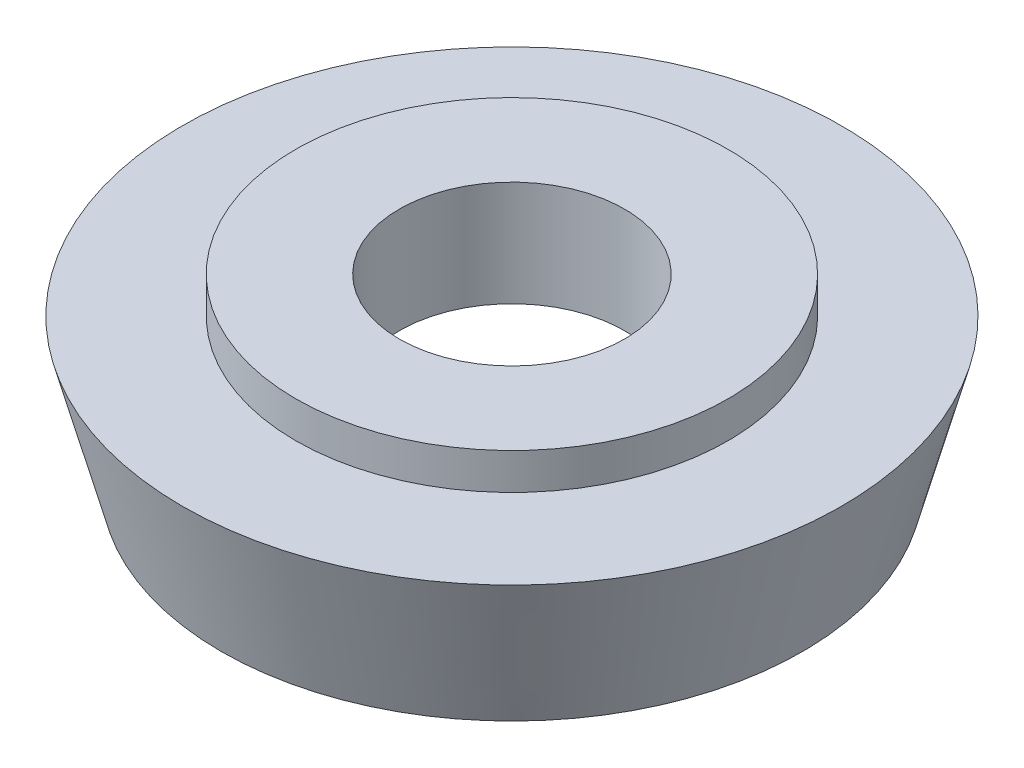
ISO-10303-21;
HEADER;
FILE_DESCRIPTION(('STEP AP214'),'2;1');
FILE_NAME('part.step','',(''),(''),'','','');
FILE_SCHEMA(('AUTOMOTIVE_DESIGN { 1 0 10303 214 1 1 1 1 }'));
ENDSEC;
DATA;
#1=APPLICATION_CONTEXT('core data for automotive mechanical design processes');
#2=APPLICATION_PROTOCOL_DEFINITION('international standard','automotive_design',2000,#1);
#3=PRODUCT_CONTEXT('',#1,'mechanical');
#4=PRODUCT('Part','Part','',(#3));
#5=PRODUCT_RELATED_PRODUCT_CATEGORY('part','',(#4));
#6=PRODUCT_DEFINITION_FORMATION('','',#4);
#7=PRODUCT_DEFINITION_CONTEXT('part definition',#1,'design');
#8=PRODUCT_DEFINITION('design','',#6,#7);
#9=PRODUCT_DEFINITION_SHAPE('','',#8);
#10=(LENGTH_UNIT() NAMED_UNIT(*) SI_UNIT(.MILLI.,.METRE.));
#11=(NAMED_UNIT(*) PLANE_ANGLE_UNIT() SI_UNIT($,.RADIAN.));
#12=(NAMED_UNIT(*) SI_UNIT($,.STERADIAN.) SOLID_ANGLE_UNIT());
#13=UNCERTAINTY_MEASURE_WITH_UNIT(LENGTH_MEASURE(1.E-05),#10,'distance_accuracy_value','');
#14=(GEOMETRIC_REPRESENTATION_CONTEXT(3) GLOBAL_UNCERTAINTY_ASSIGNED_CONTEXT((#13)) GLOBAL_UNIT_ASSIGNED_CONTEXT((#10,
#11,#12)) REPRESENTATION_CONTEXT('',''));
#15=CARTESIAN_POINT('',(0.,0.,0.));
#16=DIRECTION('',(0.,0.,1.));
#17=DIRECTION('',(1.,0.,0.));
#18=AXIS2_PLACEMENT_3D('',#15,#16,#17);
#19=CARTESIAN_POINT('',(0.,2.5,0.));
#20=DIRECTION('',(0.,1.,0.));
#21=DIRECTION('',(0.,0.,1.));
#22=AXIS2_PLACEMENT_3D('',#19,#20,#21);
#23=CYLINDRICAL_SURFACE('',#22,2.975);
#24=CARTESIAN_POINT('',(0.,2.,0.));
#25=DIRECTION('',(0.,1.,0.));
#26=DIRECTION('',(0.,0.,1.));
#27=AXIS2_PLACEMENT_3D('',#24,#25,#26);
#28=CIRCLE('',#27,2.975);
#29=CARTESIAN_POINT('',(0.,2.,2.975));
#30=VERTEX_POINT('',#29);
#31=EDGE_CURVE('E69',#30,#30,#28,.T.);
#32=ORIENTED_EDGE('',*,*,#31,.T.);
#33=EDGE_LOOP('',(#32));
#34=FACE_BOUND('',#33,.T.);
#35=CARTESIAN_POINT('',(0.,2.5,0.));
#36=DIRECTION('',(0.,1.,0.));
#37=DIRECTION('',(0.,0.,1.));
#38=AXIS2_PLACEMENT_3D('',#35,#36,#37);
#39=CIRCLE('',#38,2.975);
#40=CARTESIAN_POINT('',(0.,2.5,2.975));
#41=VERTEX_POINT('',#40);
#42=EDGE_CURVE('E10',#41,#41,#39,.T.);
#43=ORIENTED_EDGE('',*,*,#42,.F.);
#44=EDGE_LOOP('',(#43));
#45=FACE_BOUND('',#44,.T.);
#46=ADVANCED_FACE('F34',(#34,#45),#23,.T.);
#47=CARTESIAN_POINT('',(-1.55,2.5,0.));
#48=DIRECTION('',(0.,1.,0.));
#49=DIRECTION('',(0.,0.,1.));
#50=AXIS2_PLACEMENT_3D('',#47,#48,#49);
#51=PLANE('',#50);
#52=ORIENTED_EDGE('',*,*,#42,.T.);
#53=EDGE_LOOP('',(#52));
#54=FACE_BOUND('',#53,.T.);
#55=CARTESIAN_POINT('',(0.,2.5,0.));
#56=DIRECTION('',(0.,1.,0.));
#57=DIRECTION('',(0.,0.,1.));
#58=AXIS2_PLACEMENT_3D('',#55,#56,#57);
#59=CIRCLE('',#58,1.55);
#60=CARTESIAN_POINT('',(0.,2.5,1.55));
#61=VERTEX_POINT('',#60);
#62=EDGE_CURVE('E41',#61,#61,#59,.T.);
#63=ORIENTED_EDGE('',*,*,#62,.F.);
#64=EDGE_LOOP('',(#63));
#65=FACE_BOUND('',#64,.T.);
#66=ADVANCED_FACE('F88',(#54,#65),#51,.T.);
#67=CARTESIAN_POINT('',(0.,2.5,0.));
#68=DIRECTION('',(0.,1.,0.));
#69=DIRECTION('',(0.,0.,1.));
#70=AXIS2_PLACEMENT_3D('',#67,#68,#69);
#71=CYLINDRICAL_SURFACE('',#70,1.55);
#72=ORIENTED_EDGE('',*,*,#62,.T.);
#73=EDGE_LOOP('',(#72));
#74=FACE_BOUND('',#73,.T.);
#75=CARTESIAN_POINT('',(0.,1.05,0.));
#76=DIRECTION('',(0.,1.,0.));
#77=DIRECTION('',(0.,0.,1.));
#78=AXIS2_PLACEMENT_3D('',#75,#76,#77);
#79=CIRCLE('',#78,1.55);
#80=CARTESIAN_POINT('',(0.,1.05,1.55));
#81=VERTEX_POINT('',#80);
#82=EDGE_CURVE('E47',#81,#81,#79,.T.);
#83=ORIENTED_EDGE('',*,*,#82,.F.);
#84=EDGE_LOOP('',(#83));
#85=FACE_BOUND('',#84,.T.);
#86=ADVANCED_FACE('F92',(#74,#85),#71,.F.);
#87=CARTESIAN_POINT('',(-3.05,1.05,0.));
#88=DIRECTION('',(0.,-1.,0.));
#89=DIRECTION('',(0.,0.,-1.));
#90=AXIS2_PLACEMENT_3D('',#87,#88,#89);
#91=PLANE('',#90);
#92=ORIENTED_EDGE('',*,*,#82,.T.);
#93=EDGE_LOOP('',(#92));
#94=FACE_BOUND('',#93,.T.);
#95=CARTESIAN_POINT('',(0.,1.05,0.));
#96=DIRECTION('',(0.,1.,0.));
#97=DIRECTION('',(0.,0.,1.));
#98=AXIS2_PLACEMENT_3D('',#95,#96,#97);
#99=CIRCLE('',#98,3.05);
#100=CARTESIAN_POINT('',(0.,1.05,3.05));
#101=VERTEX_POINT('',#100);
#102=EDGE_CURVE('E53',#101,#101,#99,.T.);
#103=ORIENTED_EDGE('',*,*,#102,.F.);
#104=EDGE_LOOP('',(#103));
#105=FACE_BOUND('',#104,.T.);
#106=ADVANCED_FACE('F96',(#94,#105),#91,.T.);
#107=CARTESIAN_POINT('',(0.,2.5,0.));
#108=DIRECTION('',(0.,1.,0.));
#109=DIRECTION('',(0.,0.,1.));
#110=AXIS2_PLACEMENT_3D('',#107,#108,#109);
#111=CYLINDRICAL_SURFACE('',#110,3.05);
#112=ORIENTED_EDGE('',*,*,#102,.T.);
#113=EDGE_LOOP('',(#112));
#114=FACE_BOUND('',#113,.T.);
#115=CARTESIAN_POINT('',(0.,0.,0.));
#116=DIRECTION('',(0.,1.,0.));
#117=DIRECTION('',(0.,0.,1.));
#118=AXIS2_PLACEMENT_3D('',#115,#116,#117);
#119=CIRCLE('',#118,3.05);
#120=CARTESIAN_POINT('',(0.,0.,3.05));
#121=VERTEX_POINT('',#120);
#122=EDGE_CURVE('E59',#121,#121,#119,.T.);
#123=ORIENTED_EDGE('',*,*,#122,.F.);
#124=EDGE_LOOP('',(#123));
#125=FACE_BOUND('',#124,.T.);
#126=ADVANCED_FACE('F102',(#114,#125),#111,.F.);
#127=CARTESIAN_POINT('',(-4.,0.,0.));
#128=DIRECTION('',(0.,-1.,0.));
#129=DIRECTION('',(0.,0.,-1.));
#130=AXIS2_PLACEMENT_3D('',#127,#128,#129);
#131=PLANE('',#130);
#132=ORIENTED_EDGE('',*,*,#122,.T.);
#133=EDGE_LOOP('',(#132));
#134=FACE_BOUND('',#133,.T.);
#135=CARTESIAN_POINT('',(0.,0.,0.));
#136=DIRECTION('',(0.,1.,0.));
#137=DIRECTION('',(0.,0.,1.));
#138=AXIS2_PLACEMENT_3D('',#135,#136,#137);
#139=CIRCLE('',#138,4.);
#140=CARTESIAN_POINT('',(0.,0.,4.));
#141=VERTEX_POINT('',#140);
#142=EDGE_CURVE('E63',#141,#141,#139,.T.);
#143=ORIENTED_EDGE('',*,*,#142,.F.);
#144=EDGE_LOOP('',(#143));
#145=FACE_BOUND('',#144,.T.);
#146=ADVANCED_FACE('F84',(#134,#145),#131,.T.);
#147=CARTESIAN_POINT('',(0.,2.,0.));
#148=DIRECTION('',(0.,1.,0.));
#149=DIRECTION('',(0.,0.,1.));
#150=AXIS2_PLACEMENT_3D('',#147,#148,#149);
#151=CONICAL_SURFACE('',#150,4.53589838486225,0.26179938779915);
#152=ORIENTED_EDGE('',*,*,#142,.T.);
#153=EDGE_LOOP('',(#152));
#154=FACE_BOUND('',#153,.T.);
#155=CARTESIAN_POINT('',(0.,2.,0.));
#156=DIRECTION('',(0.,1.,0.));
#157=DIRECTION('',(0.,0.,1.));
#158=AXIS2_PLACEMENT_3D('',#155,#156,#157);
#159=CIRCLE('',#158,4.53589838486225);
#160=CARTESIAN_POINT('',(0.,2.,4.53589838486225));
#161=VERTEX_POINT('',#160);
#162=EDGE_CURVE('E66',#161,#161,#159,.T.);
#163=ORIENTED_EDGE('',*,*,#162,.F.);
#164=EDGE_LOOP('',(#163));
#165=FACE_BOUND('',#164,.T.);
#166=ADVANCED_FACE('F78',(#154,#165),#151,.T.);
#167=CARTESIAN_POINT('',(-2.975,2.,0.));
#168=DIRECTION('',(0.,1.,0.));
#169=DIRECTION('',(0.,0.,1.));
#170=AXIS2_PLACEMENT_3D('',#167,#168,#169);
#171=PLANE('',#170);
#172=ORIENTED_EDGE('',*,*,#162,.T.);
#173=EDGE_LOOP('',(#172));
#174=FACE_BOUND('',#173,.T.);
#175=ORIENTED_EDGE('',*,*,#31,.F.);
#176=EDGE_LOOP('',(#175));
#177=FACE_BOUND('',#176,.T.);
#178=ADVANCED_FACE('F76',(#174,#177),#171,.T.);
#179=CLOSED_SHELL('',(#46,#66,#86,#106,#126,#146,#166,#178));
#180=MANIFOLD_SOLID_BREP('B2',#179);
#181=ADVANCED_BREP_SHAPE_REPRESENTATION('',(#18,#180),#14);
#182=SHAPE_DEFINITION_REPRESENTATION(#9,#181);
ENDSEC;
END-ISO-10303-21;
